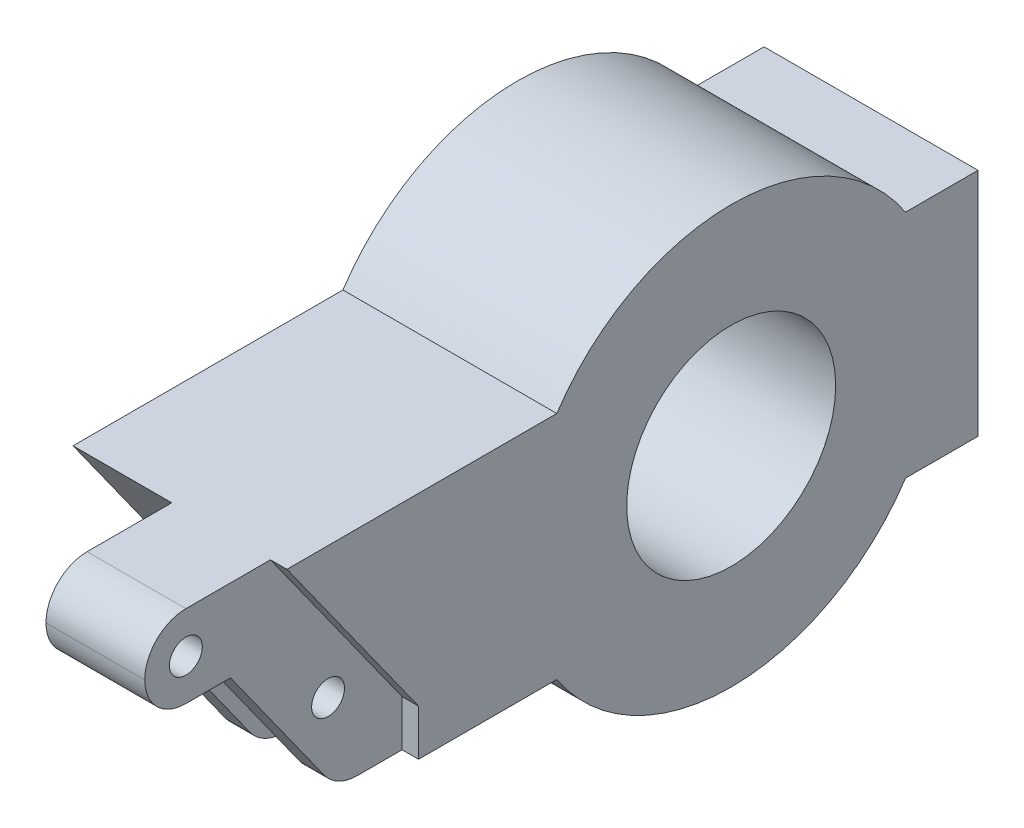
ISO-10303-21;
HEADER;
FILE_DESCRIPTION(('STEP AP214'),'2;1');
FILE_NAME('part.step','',(''),(''),'','','');
FILE_SCHEMA(('AUTOMOTIVE_DESIGN { 1 0 10303 214 1 1 1 1 }'));
ENDSEC;
DATA;
#1=APPLICATION_CONTEXT('core data for automotive mechanical design processes');
#2=APPLICATION_PROTOCOL_DEFINITION('international standard','automotive_design',2000,#1);
#3=PRODUCT_CONTEXT('',#1,'mechanical');
#4=PRODUCT('Part','Part','',(#3));
#5=PRODUCT_RELATED_PRODUCT_CATEGORY('part','',(#4));
#6=PRODUCT_DEFINITION_FORMATION('','',#4);
#7=PRODUCT_DEFINITION_CONTEXT('part definition',#1,'design');
#8=PRODUCT_DEFINITION('design','',#6,#7);
#9=PRODUCT_DEFINITION_SHAPE('','',#8);
#10=(LENGTH_UNIT() NAMED_UNIT(*) SI_UNIT(.MILLI.,.METRE.));
#11=(NAMED_UNIT(*) PLANE_ANGLE_UNIT() SI_UNIT($,.RADIAN.));
#12=(NAMED_UNIT(*) SI_UNIT($,.STERADIAN.) SOLID_ANGLE_UNIT());
#13=UNCERTAINTY_MEASURE_WITH_UNIT(LENGTH_MEASURE(1.E-05),#10,'distance_accuracy_value','');
#14=(GEOMETRIC_REPRESENTATION_CONTEXT(3) GLOBAL_UNCERTAINTY_ASSIGNED_CONTEXT((#13)) GLOBAL_UNIT_ASSIGNED_CONTEXT((#10,
#11,#12)) REPRESENTATION_CONTEXT('',''));
#15=CARTESIAN_POINT('',(0.,0.,0.));
#16=DIRECTION('',(0.,0.,1.));
#17=DIRECTION('',(1.,0.,0.));
#18=AXIS2_PLACEMENT_3D('',#15,#16,#17);
#19=CARTESIAN_POINT('',(9.,6.99999999999999,0.));
#20=DIRECTION('',(0.,1.,0.));
#21=DIRECTION('',(0.,0.,1.));
#22=AXIS2_PLACEMENT_3D('',#19,#20,#21);
#23=PLANE('',#22);
#24=DIRECTION('',(-1.,0.,0.));
#25=VECTOR('',#24,1.);
#26=CARTESIAN_POINT('',(9.,6.99999999999999,4.40330240121952));
#27=LINE('',#26,#25);
#28=CARTESIAN_POINT('',(4.,6.99999999999999,4.40330240121952));
#29=VERTEX_POINT('',#28);
#30=CARTESIAN_POINT('',(-9.,6.99999999999999,4.40330240121952));
#31=VERTEX_POINT('',#30);
#32=EDGE_CURVE('E221',#29,#31,#27,.T.);
#33=ORIENTED_EDGE('',*,*,#32,.F.);
#34=DIRECTION('',(0.,0.,-1.));
#35=VECTOR('',#34,1.);
#36=CARTESIAN_POINT('',(4.,6.99999999999999,0.));
#37=LINE('',#36,#35);
#38=CARTESIAN_POINT('',(4.,6.99999999999999,0.));
#39=VERTEX_POINT('',#38);
#40=EDGE_CURVE('E207',#29,#39,#37,.T.);
#41=ORIENTED_EDGE('',*,*,#40,.T.);
#42=DIRECTION('',(-1.,0.,0.));
#43=VECTOR('',#42,1.);
#44=CARTESIAN_POINT('',(9.,6.99999999999999,0.));
#45=LINE('',#44,#43);
#46=CARTESIAN_POINT('',(-9.,6.99999999999999,0.));
#47=VERTEX_POINT('',#46);
#48=EDGE_CURVE('E219',#39,#47,#45,.T.);
#49=ORIENTED_EDGE('',*,*,#48,.T.);
#50=DIRECTION('',(0.,0.,-1.));
#51=VECTOR('',#50,1.);
#52=CARTESIAN_POINT('',(-9.,6.99999999999999,0.));
#53=LINE('',#52,#51);
#54=EDGE_CURVE('E355',#31,#47,#53,.T.);
#55=ORIENTED_EDGE('',*,*,#54,.F.);
#56=EDGE_LOOP('',(#33,#41,#49,#55));
#57=FACE_BOUND('',#56,.T.);
#58=ADVANCED_FACE('F49',(#57),#23,.T.);
#59=CARTESIAN_POINT('',(9.,0.,15.));
#60=DIRECTION('',(-1.,0.,0.));
#61=DIRECTION('',(0.,0.,1.));
#62=AXIS2_PLACEMENT_3D('',#59,#60,#61);
#63=CYLINDRICAL_SURFACE('',#62,12.7);
#64=DIRECTION('',(-1.,0.,0.));
#65=VECTOR('',#64,1.);
#66=CARTESIAN_POINT('',(9.,6.99999999999999,25.5966975987805));
#67=LINE('',#66,#65);
#68=CARTESIAN_POINT('',(4.,6.99999999999999,25.5966975987805));
#69=VERTEX_POINT('',#68);
#70=CARTESIAN_POINT('',(-9.,6.99999999999999,25.5966975987805));
#71=VERTEX_POINT('',#70);
#72=EDGE_CURVE('E254',#69,#71,#67,.T.);
#73=ORIENTED_EDGE('',*,*,#72,.F.);
#74=CARTESIAN_POINT('',(4.,0.,15.));
#75=DIRECTION('',(1.,0.,0.));
#76=DIRECTION('',(0.,0.,-1.));
#77=AXIS2_PLACEMENT_3D('',#74,#75,#76);
#78=CIRCLE('',#77,12.7);
#79=EDGE_CURVE('E224',#29,#69,#78,.T.);
#80=ORIENTED_EDGE('',*,*,#79,.F.);
#81=ORIENTED_EDGE('',*,*,#32,.T.);
#82=CARTESIAN_POINT('',(-9.,0.,15.));
#83=DIRECTION('',(1.,0.,0.));
#84=DIRECTION('',(0.,0.,-1.));
#85=AXIS2_PLACEMENT_3D('',#82,#83,#84);
#86=CIRCLE('',#85,12.7);
#87=EDGE_CURVE('E358',#31,#71,#86,.T.);
#88=ORIENTED_EDGE('',*,*,#87,.T.);
#89=EDGE_LOOP('',(#73,#80,#81,#88));
#90=FACE_BOUND('',#89,.T.);
#91=ADVANCED_FACE('F550',(#90),#63,.T.);
#92=CARTESIAN_POINT('',(9.,6.99999999999999,0.));
#93=DIRECTION('',(0.,1.,0.));
#94=DIRECTION('',(0.,0.,1.));
#95=AXIS2_PLACEMENT_3D('',#92,#93,#94);
#96=PLANE('',#95);
#97=DIRECTION('',(1.,0.,0.));
#98=VECTOR('',#97,1.);
#99=CARTESIAN_POINT('',(-16.7989898732233,6.99999999999999,42.));
#100=LINE('',#99,#98);
#101=CARTESIAN_POINT('',(3.,6.99999999999999,42.));
#102=VERTEX_POINT('',#101);
#103=CARTESIAN_POINT('',(4.,6.99999999999999,42.));
#104=VERTEX_POINT('',#103);
#105=EDGE_CURVE('E433',#102,#104,#100,.T.);
#106=ORIENTED_EDGE('',*,*,#105,.T.);
#107=DIRECTION('',(0.,0.,-1.));
#108=VECTOR('',#107,1.);
#109=CARTESIAN_POINT('',(4.,6.99999999999999,0.));
#110=LINE('',#109,#108);
#111=EDGE_CURVE('E507',#104,#69,#110,.T.);
#112=ORIENTED_EDGE('',*,*,#111,.T.);
#113=ORIENTED_EDGE('',*,*,#72,.T.);
#114=DIRECTION('',(0.,0.,-1.));
#115=VECTOR('',#114,1.);
#116=CARTESIAN_POINT('',(-9.,6.99999999999999,0.));
#117=LINE('',#116,#115);
#118=CARTESIAN_POINT('',(-9.,6.99999999999999,42.));
#119=VERTEX_POINT('',#118);
#120=EDGE_CURVE('E362',#119,#71,#117,.T.);
#121=ORIENTED_EDGE('',*,*,#120,.F.);
#122=DIRECTION('',(-1.,0.,0.));
#123=VECTOR('',#122,1.);
#124=CARTESIAN_POINT('',(16.7989898732233,6.99999999999999,42.));
#125=LINE('',#124,#123);
#126=CARTESIAN_POINT('',(-3.,6.99999999999999,42.));
#127=VERTEX_POINT('',#126);
#128=EDGE_CURVE('E410',#127,#119,#125,.T.);
#129=ORIENTED_EDGE('',*,*,#128,.F.);
#130=DIRECTION('',(0.,0.,1.));
#131=VECTOR('',#130,1.);
#132=CARTESIAN_POINT('',(-3.,6.99999999999999,49.6420266903419));
#133=LINE('',#132,#131);
#134=CARTESIAN_POINT('',(-3.,6.99999999999999,47.1420266903419));
#135=VERTEX_POINT('',#134);
#136=EDGE_CURVE('E333',#127,#135,#133,.T.);
#137=ORIENTED_EDGE('',*,*,#136,.T.);
#138=DIRECTION('',(1.,0.,0.));
#139=VECTOR('',#138,1.);
#140=CARTESIAN_POINT('',(9.,7.,47.1420266903419));
#141=LINE('',#140,#139);
#142=CARTESIAN_POINT('',(3.,6.99999999999999,47.1420266903419));
#143=VERTEX_POINT('',#142);
#144=EDGE_CURVE('E279',#135,#143,#141,.T.);
#145=ORIENTED_EDGE('',*,*,#144,.T.);
#146=DIRECTION('',(0.,0.,-1.));
#147=VECTOR('',#146,1.);
#148=CARTESIAN_POINT('',(3.,6.99999999999999,49.6420266903419));
#149=LINE('',#148,#147);
#150=EDGE_CURVE('E342',#143,#102,#149,.T.);
#151=ORIENTED_EDGE('',*,*,#150,.T.);
#152=EDGE_LOOP('',(#106,#112,#113,#121,#129,#137,#145,#151));
#153=FACE_BOUND('',#152,.T.);
#154=ADVANCED_FACE('F506',(#153),#96,.T.);
#155=CARTESIAN_POINT('',(9.,-6.99999999999999,0.));
#156=DIRECTION('',(0.,1.,0.));
#157=DIRECTION('',(0.,0.,1.));
#158=AXIS2_PLACEMENT_3D('',#155,#156,#157);
#159=PLANE('',#158);
#160=DIRECTION('',(0.,0.,-1.));
#161=VECTOR('',#160,1.);
#162=CARTESIAN_POINT('',(4.,-6.99999999999999,0.));
#163=LINE('',#162,#161);
#164=CARTESIAN_POINT('',(4.,-7.,34.));
#165=VERTEX_POINT('',#164);
#166=CARTESIAN_POINT('',(4.,-7.,25.5966975987805));
#167=VERTEX_POINT('',#166);
#168=EDGE_CURVE('E495',#165,#167,#163,.T.);
#169=ORIENTED_EDGE('',*,*,#168,.F.);
#170=DIRECTION('',(1.,0.,0.));
#171=VECTOR('',#170,1.);
#172=CARTESIAN_POINT('',(-16.7989898732233,-7.00000000000001,34.));
#173=LINE('',#172,#171);
#174=CARTESIAN_POINT('',(3.,-7.00000000000001,34.));
#175=VERTEX_POINT('',#174);
#176=EDGE_CURVE('E427',#175,#165,#173,.T.);
#177=ORIENTED_EDGE('',*,*,#176,.F.);
#178=DIRECTION('',(0.,0.,1.));
#179=VECTOR('',#178,1.);
#180=CARTESIAN_POINT('',(3.,-7.00000000000001,38.));
#181=LINE('',#180,#179);
#182=CARTESIAN_POINT('',(3.,-7.00000000000001,36.7134552617705));
#183=VERTEX_POINT('',#182);
#184=EDGE_CURVE('E428',#175,#183,#181,.T.);
#185=ORIENTED_EDGE('',*,*,#184,.T.);
#186=DIRECTION('',(-1.,0.,0.));
#187=VECTOR('',#186,1.);
#188=CARTESIAN_POINT('',(9.,-7.00000000000001,36.7134552617705));
#189=LINE('',#188,#187);
#190=CARTESIAN_POINT('',(1.5,-7.00000000000008,36.7134552617705));
#191=VERTEX_POINT('',#190);
#192=EDGE_CURVE('E247',#183,#191,#189,.T.);
#193=ORIENTED_EDGE('',*,*,#192,.T.);
#194=DIRECTION('',(0.,0.,1.));
#195=VECTOR('',#194,1.);
#196=CARTESIAN_POINT('',(1.5,-7.00000000000007,35.9977889397873));
#197=LINE('',#196,#195);
#198=CARTESIAN_POINT('',(1.5,-7.00000000000007,35.9977889397873));
#199=VERTEX_POINT('',#198);
#200=EDGE_CURVE('E317',#199,#191,#197,.T.);
#201=ORIENTED_EDGE('',*,*,#200,.F.);
#202=DIRECTION('',(1.,0.,0.));
#203=VECTOR('',#202,1.);
#204=CARTESIAN_POINT('',(1.5,-7.00000000000007,35.9977889397873));
#205=LINE('',#204,#203);
#206=CARTESIAN_POINT('',(-1.5,-7.00000000000001,35.9977889397873));
#207=VERTEX_POINT('',#206);
#208=EDGE_CURVE('E466',#207,#199,#205,.T.);
#209=ORIENTED_EDGE('',*,*,#208,.F.);
#210=DIRECTION('',(0.,0.,-1.));
#211=VECTOR('',#210,1.);
#212=CARTESIAN_POINT('',(-1.5,-7.00000000000007,35.9977889397873));
#213=LINE('',#212,#211);
#214=CARTESIAN_POINT('',(-1.5,-7.00000000000008,36.7134552617705));
#215=VERTEX_POINT('',#214);
#216=EDGE_CURVE('E458',#215,#207,#213,.T.);
#217=ORIENTED_EDGE('',*,*,#216,.F.);
#218=CARTESIAN_POINT('',(-3.,-7.00000000000001,36.7134552617705));
#219=VERTEX_POINT('',#218);
#220=EDGE_CURVE('E246',#215,#219,#189,.T.);
#221=ORIENTED_EDGE('',*,*,#220,.T.);
#222=DIRECTION('',(0.,0.,-1.));
#223=VECTOR('',#222,1.);
#224=CARTESIAN_POINT('',(-3.,-7.00000000000001,34.));
#225=LINE('',#224,#223);
#226=CARTESIAN_POINT('',(-3.,-7.00000000000001,34.));
#227=VERTEX_POINT('',#226);
#228=EDGE_CURVE('E413',#219,#227,#225,.T.);
#229=ORIENTED_EDGE('',*,*,#228,.T.);
#230=DIRECTION('',(-1.,0.,0.));
#231=VECTOR('',#230,1.);
#232=CARTESIAN_POINT('',(16.7989898732233,-7.00000000000001,34.));
#233=LINE('',#232,#231);
#234=CARTESIAN_POINT('',(-9.,-7.00000000000001,34.));
#235=VERTEX_POINT('',#234);
#236=EDGE_CURVE('E393',#227,#235,#233,.T.);
#237=ORIENTED_EDGE('',*,*,#236,.T.);
#238=DIRECTION('',(0.,0.,-1.));
#239=VECTOR('',#238,1.);
#240=CARTESIAN_POINT('',(-9.,-6.99999999999999,0.));
#241=LINE('',#240,#239);
#242=CARTESIAN_POINT('',(-9.,-7.,25.5966975987805));
#243=VERTEX_POINT('',#242);
#244=EDGE_CURVE('E366',#235,#243,#241,.T.);
#245=ORIENTED_EDGE('',*,*,#244,.T.);
#246=DIRECTION('',(-1.,0.,0.));
#247=VECTOR('',#246,1.);
#248=CARTESIAN_POINT('',(9.,-7.,25.5966975987805));
#249=LINE('',#248,#247);
#250=EDGE_CURVE('E243',#167,#243,#249,.T.);
#251=ORIENTED_EDGE('',*,*,#250,.F.);
#252=EDGE_LOOP('',(#169,#177,#185,#193,#201,#209,#217,#221,#229,#237,#245,#251));
#253=FACE_BOUND('',#252,.T.);
#254=ADVANCED_FACE('F391',(#253),#159,.F.);
#255=CARTESIAN_POINT('',(9.,0.,15.));
#256=DIRECTION('',(-1.,0.,0.));
#257=DIRECTION('',(0.,0.,1.));
#258=AXIS2_PLACEMENT_3D('',#255,#256,#257);
#259=CYLINDRICAL_SURFACE('',#258,12.7);
#260=CARTESIAN_POINT('',(4.,0.,15.));
#261=DIRECTION('',(1.,0.,0.));
#262=DIRECTION('',(0.,0.,-1.));
#263=AXIS2_PLACEMENT_3D('',#260,#261,#262);
#264=CIRCLE('',#263,12.7);
#265=CARTESIAN_POINT('',(4.,-6.99999999999999,4.40330240121952));
#266=VERTEX_POINT('',#265);
#267=EDGE_CURVE('E223',#167,#266,#264,.T.);
#268=ORIENTED_EDGE('',*,*,#267,.F.);
#269=ORIENTED_EDGE('',*,*,#250,.T.);
#270=CARTESIAN_POINT('',(-9.,0.,15.));
#271=DIRECTION('',(1.,0.,0.));
#272=DIRECTION('',(0.,0.,-1.));
#273=AXIS2_PLACEMENT_3D('',#270,#271,#272);
#274=CIRCLE('',#273,12.7);
#275=CARTESIAN_POINT('',(-9.,-6.99999999999999,4.40330240121952));
#276=VERTEX_POINT('',#275);
#277=EDGE_CURVE('E370',#243,#276,#274,.T.);
#278=ORIENTED_EDGE('',*,*,#277,.T.);
#279=DIRECTION('',(-1.,0.,0.));
#280=VECTOR('',#279,1.);
#281=CARTESIAN_POINT('',(9.,-6.99999999999999,4.40330240121952));
#282=LINE('',#281,#280);
#283=EDGE_CURVE('E235',#266,#276,#282,.T.);
#284=ORIENTED_EDGE('',*,*,#283,.F.);
#285=EDGE_LOOP('',(#268,#269,#278,#284));
#286=FACE_BOUND('',#285,.T.);
#287=ADVANCED_FACE('F385',(#286),#259,.T.);
#288=CARTESIAN_POINT('',(9.,-6.99999999999999,0.));
#289=DIRECTION('',(0.,1.,0.));
#290=DIRECTION('',(0.,0.,1.));
#291=AXIS2_PLACEMENT_3D('',#288,#289,#290);
#292=PLANE('',#291);
#293=DIRECTION('',(0.,0.,-1.));
#294=VECTOR('',#293,1.);
#295=CARTESIAN_POINT('',(4.,-6.99999999999999,0.));
#296=LINE('',#295,#294);
#297=CARTESIAN_POINT('',(4.,-6.99999999999999,0.));
#298=VERTEX_POINT('',#297);
#299=EDGE_CURVE('E210',#266,#298,#296,.T.);
#300=ORIENTED_EDGE('',*,*,#299,.F.);
#301=ORIENTED_EDGE('',*,*,#283,.T.);
#302=DIRECTION('',(0.,0.,-1.));
#303=VECTOR('',#302,1.);
#304=CARTESIAN_POINT('',(-9.,-6.99999999999999,0.));
#305=LINE('',#304,#303);
#306=CARTESIAN_POINT('',(-9.,-6.99999999999999,0.));
#307=VERTEX_POINT('',#306);
#308=EDGE_CURVE('E237',#276,#307,#305,.T.);
#309=ORIENTED_EDGE('',*,*,#308,.T.);
#310=DIRECTION('',(-1.,0.,0.));
#311=VECTOR('',#310,1.);
#312=CARTESIAN_POINT('',(9.,-6.99999999999999,0.));
#313=LINE('',#312,#311);
#314=EDGE_CURVE('E231',#298,#307,#313,.T.);
#315=ORIENTED_EDGE('',*,*,#314,.F.);
#316=EDGE_LOOP('',(#300,#301,#309,#315));
#317=FACE_BOUND('',#316,.T.);
#318=ADVANCED_FACE('F377',(#317),#292,.F.);
#319=CARTESIAN_POINT('',(9.,0.,15.));
#320=DIRECTION('',(-1.,0.,0.));
#321=DIRECTION('',(0.,0.,1.));
#322=AXIS2_PLACEMENT_3D('',#319,#320,#321);
#323=CYLINDRICAL_SURFACE('',#322,6.35);
#324=CARTESIAN_POINT('',(-9.,0.,15.));
#325=DIRECTION('',(1.,0.,0.));
#326=DIRECTION('',(0.,0.,-1.));
#327=AXIS2_PLACEMENT_3D('',#324,#325,#326);
#328=CIRCLE('',#327,6.35);
#329=CARTESIAN_POINT('',(-9.,0.,8.65));
#330=VERTEX_POINT('',#329);
#331=EDGE_CURVE('E346',#330,#330,#328,.T.);
#332=ORIENTED_EDGE('',*,*,#331,.F.);
#333=EDGE_LOOP('',(#332));
#334=FACE_BOUND('',#333,.T.);
#335=CARTESIAN_POINT('',(4.,0.,15.));
#336=DIRECTION('',(1.,0.,0.));
#337=DIRECTION('',(0.,0.,-1.));
#338=AXIS2_PLACEMENT_3D('',#335,#336,#337);
#339=CIRCLE('',#338,6.35);
#340=CARTESIAN_POINT('',(4.,0.,8.65));
#341=VERTEX_POINT('',#340);
#342=EDGE_CURVE('E406',#341,#341,#339,.T.);
#343=ORIENTED_EDGE('',*,*,#342,.T.);
#344=EDGE_LOOP('',(#343));
#345=FACE_BOUND('',#344,.T.);
#346=ADVANCED_FACE('F587',(#334,#345),#323,.F.);
#347=CARTESIAN_POINT('',(9.,0.,0.));
#348=DIRECTION('',(0.,0.,1.));
#349=DIRECTION('',(0.,-1.,0.));
#350=AXIS2_PLACEMENT_3D('',#347,#348,#349);
#351=PLANE('',#350);
#352=DIRECTION('',(0.,-1.,0.));
#353=VECTOR('',#352,1.);
#354=CARTESIAN_POINT('',(4.,12.7,0.));
#355=LINE('',#354,#353);
#356=EDGE_CURVE('E204',#39,#298,#355,.T.);
#357=ORIENTED_EDGE('',*,*,#356,.T.);
#358=ORIENTED_EDGE('',*,*,#314,.T.);
#359=DIRECTION('',(0.,1.,0.));
#360=VECTOR('',#359,1.);
#361=CARTESIAN_POINT('',(-9.,0.,0.));
#362=LINE('',#361,#360);
#363=EDGE_CURVE('E228',#307,#47,#362,.T.);
#364=ORIENTED_EDGE('',*,*,#363,.T.);
#365=ORIENTED_EDGE('',*,*,#48,.F.);
#366=EDGE_LOOP('',(#357,#358,#364,#365));
#367=FACE_BOUND('',#366,.T.);
#368=ADVANCED_FACE('F226',(#367),#351,.F.);
#369=CARTESIAN_POINT('',(-16.7989898732233,6.99999999999999,42.));
#370=DIRECTION('',(0.,0.581238193719096,-0.813733471206735));
#371=DIRECTION('',(0.,0.813733471206735,0.581238193719096));
#372=AXIS2_PLACEMENT_3D('',#369,#370,#371);
#373=PLANE('',#372);
#374=DIRECTION('',(0.,-0.813733471206735,-0.581238193719096));
#375=VECTOR('',#374,1.);
#376=CARTESIAN_POINT('',(4.,6.99999999999999,42.));
#377=LINE('',#376,#375);
#378=CARTESIAN_POINT('',(4.,-4.20000000000001,34.));
#379=VERTEX_POINT('',#378);
#380=EDGE_CURVE('E64',#104,#379,#377,.T.);
#381=ORIENTED_EDGE('',*,*,#380,.F.);
#382=ORIENTED_EDGE('',*,*,#105,.F.);
#383=DIRECTION('',(0.,-0.813733471206735,-0.581238193719096));
#384=VECTOR('',#383,1.);
#385=CARTESIAN_POINT('',(3.,6.99999999999999,42.));
#386=LINE('',#385,#384);
#387=CARTESIAN_POINT('',(3.,-4.20000000000001,34.));
#388=VERTEX_POINT('',#387);
#389=EDGE_CURVE('E436',#102,#388,#386,.T.);
#390=ORIENTED_EDGE('',*,*,#389,.T.);
#391=DIRECTION('',(1.,0.,0.));
#392=VECTOR('',#391,1.);
#393=CARTESIAN_POINT('',(-16.7989898732233,-4.20000000000001,34.));
#394=LINE('',#393,#392);
#395=EDGE_CURVE('E443',#388,#379,#394,.T.);
#396=ORIENTED_EDGE('',*,*,#395,.T.);
#397=EDGE_LOOP('',(#381,#382,#390,#396));
#398=FACE_BOUND('',#397,.T.);
#399=ADVANCED_FACE('F503',(#398),#373,.F.);
#400=CARTESIAN_POINT('',(-16.7989898732233,-4.20000000000001,34.));
#401=DIRECTION('',(0.,0.,-1.));
#402=DIRECTION('',(-1.,0.,0.));
#403=AXIS2_PLACEMENT_3D('',#400,#401,#402);
#404=PLANE('',#403);
#405=DIRECTION('',(0.,-1.,0.));
#406=VECTOR('',#405,1.);
#407=CARTESIAN_POINT('',(4.,-4.20000000000001,34.));
#408=LINE('',#407,#406);
#409=EDGE_CURVE('E11',#379,#165,#408,.T.);
#410=ORIENTED_EDGE('',*,*,#409,.F.);
#411=ORIENTED_EDGE('',*,*,#395,.F.);
#412=DIRECTION('',(0.,-1.,0.));
#413=VECTOR('',#412,1.);
#414=CARTESIAN_POINT('',(3.,-4.20000000000001,34.));
#415=LINE('',#414,#413);
#416=EDGE_CURVE('E432',#388,#175,#415,.T.);
#417=ORIENTED_EDGE('',*,*,#416,.T.);
#418=ORIENTED_EDGE('',*,*,#176,.T.);
#419=EDGE_LOOP('',(#410,#411,#417,#418));
#420=FACE_BOUND('',#419,.T.);
#421=ADVANCED_FACE('F497',(#420),#404,.F.);
#422=CARTESIAN_POINT('',(9.,-20.3378378378378,28.472972972973));
#423=DIRECTION('',(0.,0.581238193719097,-0.813733471206735));
#424=DIRECTION('',(0.,0.813733471206735,0.581238193719097));
#425=AXIS2_PLACEMENT_3D('',#422,#423,#424);
#426=PLANE('',#425);
#427=DIRECTION('',(0.,-0.813733471206735,-0.581238193719097));
#428=VECTOR('',#427,1.);
#429=CARTESIAN_POINT('',(-3.,-7.00000000000001,38.));
#430=LINE('',#429,#428);
#431=CARTESIAN_POINT('',(-3.,1.99999999999999,44.4285714285714));
#432=VERTEX_POINT('',#431);
#433=CARTESIAN_POINT('',(-3.,-5.95309548429775,38.7477889397873));
#434=VERTEX_POINT('',#433);
#435=EDGE_CURVE('E526',#432,#434,#430,.T.);
#436=ORIENTED_EDGE('',*,*,#435,.T.);
#437=DIRECTION('',(-1.,0.,0.));
#438=VECTOR('',#437,1.);
#439=CARTESIAN_POINT('',(9.,-5.95309548429775,38.7477889397873));
#440=LINE('',#439,#438);
#441=CARTESIAN_POINT('',(-1.5,-5.95309548429775,38.7477889397873));
#442=VERTEX_POINT('',#441);
#443=EDGE_CURVE('E250',#442,#434,#440,.T.);
#444=ORIENTED_EDGE('',*,*,#443,.F.);
#445=DIRECTION('',(0.,0.813733471206735,0.581238193719097));
#446=VECTOR('',#445,1.);
#447=CARTESIAN_POINT('',(-1.5,-20.3378378378378,28.472972972973));
#448=LINE('',#447,#446);
#449=CARTESIAN_POINT('',(-1.5,0.499999999999908,43.3571428571428));
#450=VERTEX_POINT('',#449);
#451=EDGE_CURVE('E287',#442,#450,#448,.T.);
#452=ORIENTED_EDGE('',*,*,#451,.T.);
#453=DIRECTION('',(-1.,0.,0.));
#454=VECTOR('',#453,1.);
#455=CARTESIAN_POINT('',(9.,0.499999999999907,43.3571428571428));
#456=LINE('',#455,#454);
#457=CARTESIAN_POINT('',(1.5,0.499999999999908,43.3571428571428));
#458=VERTEX_POINT('',#457);
#459=EDGE_CURVE('E58',#458,#450,#456,.T.);
#460=ORIENTED_EDGE('',*,*,#459,.F.);
#461=DIRECTION('',(0.,-0.813733471206735,-0.581238193719097));
#462=VECTOR('',#461,1.);
#463=CARTESIAN_POINT('',(1.50000000000001,-20.3378378378378,28.472972972973));
#464=LINE('',#463,#462);
#465=CARTESIAN_POINT('',(1.5,-5.95309548429775,38.7477889397873));
#466=VERTEX_POINT('',#465);
#467=EDGE_CURVE('E298',#458,#466,#464,.T.);
#468=ORIENTED_EDGE('',*,*,#467,.T.);
#469=CARTESIAN_POINT('',(3.,-5.95309548429775,38.7477889397873));
#470=VERTEX_POINT('',#469);
#471=EDGE_CURVE('E251',#470,#466,#440,.T.);
#472=ORIENTED_EDGE('',*,*,#471,.F.);
#473=DIRECTION('',(0.,0.813733471206735,0.581238193719097));
#474=VECTOR('',#473,1.);
#475=CARTESIAN_POINT('',(3.,6.99999999999999,48.));
#476=LINE('',#475,#474);
#477=CARTESIAN_POINT('',(3.,1.99999999999999,44.4285714285714));
#478=VERTEX_POINT('',#477);
#479=EDGE_CURVE('E439',#470,#478,#476,.T.);
#480=ORIENTED_EDGE('',*,*,#479,.T.);
#481=DIRECTION('',(1.,0.,0.));
#482=VECTOR('',#481,1.);
#483=CARTESIAN_POINT('',(9.,1.99999999999999,44.4285714285714));
#484=LINE('',#483,#482);
#485=EDGE_CURVE('E259',#432,#478,#484,.T.);
#486=ORIENTED_EDGE('',*,*,#485,.F.);
#487=EDGE_LOOP('',(#436,#444,#452,#460,#468,#472,#480,#486));
#488=FACE_BOUND('',#487,.T.);
#489=ADVANCED_FACE('F321',(#488),#426,.F.);
#490=CARTESIAN_POINT('',(9.,-4.50000000000001,36.7134552617705));
#491=DIRECTION('',(-1.,0.,0.));
#492=DIRECTION('',(0.,0.,1.));
#493=AXIS2_PLACEMENT_3D('',#490,#491,#492);
#494=CYLINDRICAL_SURFACE('',#493,2.5);
#495=CARTESIAN_POINT('',(-3.,-4.50000000000001,36.7134552617705));
#496=DIRECTION('',(-1.,0.,0.));
#497=DIRECTION('',(0.,0.,1.));
#498=AXIS2_PLACEMENT_3D('',#495,#496,#497);
#499=CIRCLE('',#498,2.5);
#500=EDGE_CURVE('E424',#219,#434,#499,.T.);
#501=ORIENTED_EDGE('',*,*,#500,.F.);
#502=ORIENTED_EDGE('',*,*,#220,.F.);
#503=CARTESIAN_POINT('',(-1.5,-4.50000000000001,36.7134552617705));
#504=DIRECTION('',(-1.,0.,0.));
#505=DIRECTION('',(0.,0.,1.));
#506=AXIS2_PLACEMENT_3D('',#503,#504,#505);
#507=CIRCLE('',#506,2.5);
#508=EDGE_CURVE('E297',#215,#442,#507,.T.);
#509=ORIENTED_EDGE('',*,*,#508,.T.);
#510=ORIENTED_EDGE('',*,*,#443,.T.);
#511=EDGE_LOOP('',(#501,#502,#509,#510));
#512=FACE_BOUND('',#511,.T.);
#513=ADVANCED_FACE('F564',(#512),#494,.T.);
#514=CARTESIAN_POINT('',(9.,-2.00000000000001,38.4991695474848));
#515=DIRECTION('',(-1.,0.,0.));
#516=DIRECTION('',(0.,0.,1.));
#517=AXIS2_PLACEMENT_3D('',#514,#515,#516);
#518=CYLINDRICAL_SURFACE('',#517,0.999999999999998);
#519=CARTESIAN_POINT('',(-1.5,-2.00000000000001,38.4991695474848));
#520=DIRECTION('',(-1.,0.,0.));
#521=DIRECTION('',(0.,0.,1.));
#522=AXIS2_PLACEMENT_3D('',#519,#520,#521);
#523=CIRCLE('',#522,0.999999999999998);
#524=CARTESIAN_POINT('',(-1.5,-2.00000000000001,39.4991695474848));
#525=VERTEX_POINT('',#524);
#526=EDGE_CURVE('E294',#525,#525,#523,.T.);
#527=ORIENTED_EDGE('',*,*,#526,.F.);
#528=EDGE_LOOP('',(#527));
#529=FACE_BOUND('',#528,.T.);
#530=CARTESIAN_POINT('',(-3.,-2.00000000000001,38.4991695474848));
#531=DIRECTION('',(-1.,0.,0.));
#532=DIRECTION('',(0.,0.,1.));
#533=AXIS2_PLACEMENT_3D('',#530,#531,#532);
#534=CIRCLE('',#533,0.999999999999998);
#535=CARTESIAN_POINT('',(-3.,-2.00000000000001,39.4991695474848));
#536=VERTEX_POINT('',#535);
#537=EDGE_CURVE('E419',#536,#536,#534,.T.);
#538=ORIENTED_EDGE('',*,*,#537,.T.);
#539=EDGE_LOOP('',(#538));
#540=FACE_BOUND('',#539,.T.);
#541=ADVANCED_FACE('F594',(#529,#540),#518,.F.);
#542=CARTESIAN_POINT('',(3.,-4.50000000000001,36.7134552617705));
#543=DIRECTION('',(1.,0.,0.));
#544=DIRECTION('',(0.,0.,-1.));
#545=AXIS2_PLACEMENT_3D('',#542,#543,#544);
#546=CIRCLE('',#545,2.5);
#547=EDGE_CURVE('E456',#470,#183,#546,.T.);
#548=ORIENTED_EDGE('',*,*,#547,.F.);
#549=ORIENTED_EDGE('',*,*,#471,.T.);
#550=CARTESIAN_POINT('',(1.5,-4.50000000000001,36.7134552617705));
#551=DIRECTION('',(1.,0.,0.));
#552=DIRECTION('',(0.,0.,-1.));
#553=AXIS2_PLACEMENT_3D('',#550,#551,#552);
#554=CIRCLE('',#553,2.5);
#555=EDGE_CURVE('E292',#466,#191,#554,.T.);
#556=ORIENTED_EDGE('',*,*,#555,.T.);
#557=ORIENTED_EDGE('',*,*,#192,.F.);
#558=EDGE_LOOP('',(#548,#549,#556,#557));
#559=FACE_BOUND('',#558,.T.);
#560=ADVANCED_FACE('F487',(#559),#494,.T.);
#561=CARTESIAN_POINT('',(1.5,-2.00000000000001,38.4991695474848));
#562=DIRECTION('',(1.,0.,0.));
#563=DIRECTION('',(0.,0.,-1.));
#564=AXIS2_PLACEMENT_3D('',#561,#562,#563);
#565=CIRCLE('',#564,0.999999999999998);
#566=CARTESIAN_POINT('',(1.5,-2.00000000000001,37.4991695474848));
#567=VERTEX_POINT('',#566);
#568=EDGE_CURVE('E288',#567,#567,#565,.T.);
#569=ORIENTED_EDGE('',*,*,#568,.F.);
#570=EDGE_LOOP('',(#569));
#571=FACE_BOUND('',#570,.T.);
#572=CARTESIAN_POINT('',(3.,-2.00000000000001,38.4991695474848));
#573=DIRECTION('',(1.,0.,0.));
#574=DIRECTION('',(0.,0.,-1.));
#575=AXIS2_PLACEMENT_3D('',#572,#573,#574);
#576=CIRCLE('',#575,0.999999999999998);
#577=CARTESIAN_POINT('',(3.,-2.00000000000001,37.4991695474848));
#578=VERTEX_POINT('',#577);
#579=EDGE_CURVE('E452',#578,#578,#576,.T.);
#580=ORIENTED_EDGE('',*,*,#579,.T.);
#581=EDGE_LOOP('',(#580));
#582=FACE_BOUND('',#581,.T.);
#583=ADVANCED_FACE('F591',(#571,#582),#518,.F.);
#584=CARTESIAN_POINT('',(-9.,0.,0.));
#585=DIRECTION('',(1.,0.,0.));
#586=DIRECTION('',(0.,0.,-1.));
#587=AXIS2_PLACEMENT_3D('',#584,#585,#586);
#588=PLANE('',#587);
#589=ORIENTED_EDGE('',*,*,#331,.T.);
#590=EDGE_LOOP('',(#589));
#591=FACE_BOUND('',#590,.T.);
#592=DIRECTION('',(0.,-1.,0.));
#593=VECTOR('',#592,1.);
#594=CARTESIAN_POINT('',(-9.,-4.20000000000003,34.));
#595=LINE('',#594,#593);
#596=CARTESIAN_POINT('',(-9.,-4.20000000000003,34.));
#597=VERTEX_POINT('',#596);
#598=EDGE_CURVE('E395',#597,#235,#595,.T.);
#599=ORIENTED_EDGE('',*,*,#598,.F.);
#600=DIRECTION('',(0.,-0.813733471206735,-0.581238193719096));
#601=VECTOR('',#600,1.);
#602=CARTESIAN_POINT('',(-9.,6.99999999999999,42.));
#603=LINE('',#602,#601);
#604=EDGE_CURVE('E397',#119,#597,#603,.T.);
#605=ORIENTED_EDGE('',*,*,#604,.F.);
#606=ORIENTED_EDGE('',*,*,#120,.T.);
#607=ORIENTED_EDGE('',*,*,#87,.F.);
#608=ORIENTED_EDGE('',*,*,#54,.T.);
#609=ORIENTED_EDGE('',*,*,#363,.F.);
#610=ORIENTED_EDGE('',*,*,#308,.F.);
#611=ORIENTED_EDGE('',*,*,#277,.F.);
#612=ORIENTED_EDGE('',*,*,#244,.F.);
#613=EDGE_LOOP('',(#599,#605,#606,#607,#608,#609,#610,#611,#612));
#614=FACE_BOUND('',#613,.T.);
#615=ADVANCED_FACE('F382',(#591,#614),#588,.F.);
#616=CARTESIAN_POINT('',(0.,1.99999999999999,0.));
#617=DIRECTION('',(0.,1.,0.));
#618=DIRECTION('',(0.,0.,1.));
#619=AXIS2_PLACEMENT_3D('',#616,#617,#618);
#620=PLANE('',#619);
#621=DIRECTION('',(0.,0.,-1.));
#622=VECTOR('',#621,1.);
#623=CARTESIAN_POINT('',(3.,1.99999999999999,49.6420266903419));
#624=LINE('',#623,#622);
#625=CARTESIAN_POINT('',(3.,1.99999999999999,47.1420266903419));
#626=VERTEX_POINT('',#625);
#627=EDGE_CURVE('E341',#626,#478,#624,.T.);
#628=ORIENTED_EDGE('',*,*,#627,.F.);
#629=DIRECTION('',(1.,0.,0.));
#630=VECTOR('',#629,1.);
#631=CARTESIAN_POINT('',(-3.,1.99999999999999,47.1420266903419));
#632=LINE('',#631,#630);
#633=CARTESIAN_POINT('',(-3.,1.99999999999999,47.1420266903419));
#634=VERTEX_POINT('',#633);
#635=EDGE_CURVE('E269',#626,#634,#632,.F.);
#636=ORIENTED_EDGE('',*,*,#635,.T.);
#637=DIRECTION('',(0.,0.,1.));
#638=VECTOR('',#637,1.);
#639=CARTESIAN_POINT('',(-3.,1.99999999999999,49.6420266903419));
#640=LINE('',#639,#638);
#641=EDGE_CURVE('E337',#432,#634,#640,.T.);
#642=ORIENTED_EDGE('',*,*,#641,.F.);
#643=ORIENTED_EDGE('',*,*,#485,.T.);
#644=EDGE_LOOP('',(#628,#636,#642,#643));
#645=FACE_BOUND('',#644,.T.);
#646=ADVANCED_FACE('F519',(#645),#620,.F.);
#647=CARTESIAN_POINT('',(-3.,1.99999999999999,49.6420266903419));
#648=DIRECTION('',(-1.,0.,0.));
#649=DIRECTION('',(0.,0.,1.));
#650=AXIS2_PLACEMENT_3D('',#647,#648,#649);
#651=PLANE('',#650);
#652=CARTESIAN_POINT('',(-3.,4.49999999999999,47.1420266903419));
#653=DIRECTION('',(-1.,0.,0.));
#654=DIRECTION('',(0.,0.,1.));
#655=AXIS2_PLACEMENT_3D('',#652,#653,#654);
#656=CIRCLE('',#655,0.999999999999998);
#657=CARTESIAN_POINT('',(-3.,4.49999999999999,48.1420266903419));
#658=VERTEX_POINT('',#657);
#659=EDGE_CURVE('E286',#658,#658,#656,.F.);
#660=ORIENTED_EDGE('',*,*,#659,.T.);
#661=EDGE_LOOP('',(#660));
#662=FACE_BOUND('',#661,.T.);
#663=ORIENTED_EDGE('',*,*,#136,.F.);
#664=DIRECTION('',(0.,0.813733471206735,0.581238193719096));
#665=VECTOR('',#664,1.);
#666=CARTESIAN_POINT('',(-3.,6.99999999999999,42.));
#667=LINE('',#666,#665);
#668=CARTESIAN_POINT('',(-3.,-4.20000000000003,34.));
#669=VERTEX_POINT('',#668);
#670=EDGE_CURVE('E420',#669,#127,#667,.T.);
#671=ORIENTED_EDGE('',*,*,#670,.F.);
#672=DIRECTION('',(0.,1.,0.));
#673=VECTOR('',#672,1.);
#674=CARTESIAN_POINT('',(-3.,-4.20000000000003,34.));
#675=LINE('',#674,#673);
#676=EDGE_CURVE('E416',#227,#669,#675,.T.);
#677=ORIENTED_EDGE('',*,*,#676,.F.);
#678=ORIENTED_EDGE('',*,*,#228,.F.);
#679=ORIENTED_EDGE('',*,*,#500,.T.);
#680=ORIENTED_EDGE('',*,*,#435,.F.);
#681=ORIENTED_EDGE('',*,*,#641,.T.);
#682=CARTESIAN_POINT('',(-3.,4.49999999999999,47.1420266903419));
#683=DIRECTION('',(-1.,0.,0.));
#684=DIRECTION('',(0.,0.,1.));
#685=AXIS2_PLACEMENT_3D('',#682,#683,#684);
#686=CIRCLE('',#685,2.5);
#687=CARTESIAN_POINT('',(-3.,4.5,49.6420266903419));
#688=VERTEX_POINT('',#687);
#689=EDGE_CURVE('E276',#634,#688,#686,.T.);
#690=ORIENTED_EDGE('',*,*,#689,.T.);
#691=CARTESIAN_POINT('',(-3.,4.5,47.1420266903419));
#692=DIRECTION('',(-1.,0.,0.));
#693=DIRECTION('',(0.,0.,1.));
#694=AXIS2_PLACEMENT_3D('',#691,#692,#693);
#695=CIRCLE('',#694,2.5);
#696=EDGE_CURVE('E273',#688,#135,#695,.T.);
#697=ORIENTED_EDGE('',*,*,#696,.T.);
#698=EDGE_LOOP('',(#663,#671,#677,#678,#679,#680,#681,#690,#697));
#699=FACE_BOUND('',#698,.T.);
#700=ORIENTED_EDGE('',*,*,#537,.F.);
#701=EDGE_LOOP('',(#700));
#702=FACE_BOUND('',#701,.T.);
#703=ADVANCED_FACE('F524',(#662,#699,#702),#651,.T.);
#704=CARTESIAN_POINT('',(3.,1.99999999999999,49.6420266903419));
#705=DIRECTION('',(1.,0.,0.));
#706=DIRECTION('',(0.,0.,-1.));
#707=AXIS2_PLACEMENT_3D('',#704,#705,#706);
#708=PLANE('',#707);
#709=ORIENTED_EDGE('',*,*,#389,.F.);
#710=ORIENTED_EDGE('',*,*,#150,.F.);
#711=CARTESIAN_POINT('',(3.,4.5,47.1420266903419));
#712=DIRECTION('',(1.,0.,0.));
#713=DIRECTION('',(0.,0.,-1.));
#714=AXIS2_PLACEMENT_3D('',#711,#712,#713);
#715=CIRCLE('',#714,2.5);
#716=CARTESIAN_POINT('',(3.,4.5,49.6420266903419));
#717=VERTEX_POINT('',#716);
#718=EDGE_CURVE('E263',#143,#717,#715,.T.);
#719=ORIENTED_EDGE('',*,*,#718,.T.);
#720=CARTESIAN_POINT('',(3.,4.49999999999999,47.1420266903419));
#721=DIRECTION('',(1.,0.,0.));
#722=DIRECTION('',(0.,0.,-1.));
#723=AXIS2_PLACEMENT_3D('',#720,#721,#722);
#724=CIRCLE('',#723,2.5);
#725=EDGE_CURVE('E266',#717,#626,#724,.T.);
#726=ORIENTED_EDGE('',*,*,#725,.T.);
#727=ORIENTED_EDGE('',*,*,#627,.T.);
#728=ORIENTED_EDGE('',*,*,#479,.F.);
#729=ORIENTED_EDGE('',*,*,#547,.T.);
#730=ORIENTED_EDGE('',*,*,#184,.F.);
#731=ORIENTED_EDGE('',*,*,#416,.F.);
#732=EDGE_LOOP('',(#709,#710,#719,#726,#727,#728,#729,#730,#731));
#733=FACE_BOUND('',#732,.T.);
#734=CARTESIAN_POINT('',(3.,4.49999999999999,47.1420266903419));
#735=DIRECTION('',(1.,0.,0.));
#736=DIRECTION('',(0.,0.,-1.));
#737=AXIS2_PLACEMENT_3D('',#734,#735,#736);
#738=CIRCLE('',#737,0.999999999999998);
#739=CARTESIAN_POINT('',(3.,4.49999999999999,46.1420266903419));
#740=VERTEX_POINT('',#739);
#741=EDGE_CURVE('E329',#740,#740,#738,.T.);
#742=ORIENTED_EDGE('',*,*,#741,.F.);
#743=EDGE_LOOP('',(#742));
#744=FACE_BOUND('',#743,.T.);
#745=ORIENTED_EDGE('',*,*,#579,.F.);
#746=EDGE_LOOP('',(#745));
#747=FACE_BOUND('',#746,.T.);
#748=ADVANCED_FACE('F491',(#733,#744,#747),#708,.T.);
#749=CARTESIAN_POINT('',(-9.001,4.49999999999999,47.1420266903419));
#750=DIRECTION('',(1.,0.,0.));
#751=DIRECTION('',(0.,0.,-1.));
#752=AXIS2_PLACEMENT_3D('',#749,#750,#751);
#753=CYLINDRICAL_SURFACE('',#752,0.999999999999998);
#754=ORIENTED_EDGE('',*,*,#659,.F.);
#755=EDGE_LOOP('',(#754));
#756=FACE_BOUND('',#755,.T.);
#757=ORIENTED_EDGE('',*,*,#741,.T.);
#758=EDGE_LOOP('',(#757));
#759=FACE_BOUND('',#758,.T.);
#760=ADVANCED_FACE('F601',(#756,#759),#753,.F.);
#761=CARTESIAN_POINT('',(9.,4.5,47.1420266903419));
#762=DIRECTION('',(1.,0.,0.));
#763=DIRECTION('',(0.,0.,-1.));
#764=AXIS2_PLACEMENT_3D('',#761,#762,#763);
#765=CYLINDRICAL_SURFACE('',#764,2.5);
#766=ORIENTED_EDGE('',*,*,#144,.F.);
#767=ORIENTED_EDGE('',*,*,#696,.F.);
#768=DIRECTION('',(1.,0.,0.));
#769=VECTOR('',#768,1.);
#770=CARTESIAN_POINT('',(3.,4.5,49.6420266903419));
#771=LINE('',#770,#769);
#772=EDGE_CURVE('E282',#717,#688,#771,.F.);
#773=ORIENTED_EDGE('',*,*,#772,.F.);
#774=ORIENTED_EDGE('',*,*,#718,.F.);
#775=EDGE_LOOP('',(#766,#767,#773,#774));
#776=FACE_BOUND('',#775,.T.);
#777=ADVANCED_FACE('F51',(#776),#765,.T.);
#778=CARTESIAN_POINT('',(3.,4.49999999999999,47.1420266903419));
#779=DIRECTION('',(-1.,0.,0.));
#780=DIRECTION('',(0.,0.,1.));
#781=AXIS2_PLACEMENT_3D('',#778,#779,#780);
#782=CYLINDRICAL_SURFACE('',#781,2.5);
#783=ORIENTED_EDGE('',*,*,#689,.F.);
#784=ORIENTED_EDGE('',*,*,#635,.F.);
#785=ORIENTED_EDGE('',*,*,#725,.F.);
#786=ORIENTED_EDGE('',*,*,#772,.T.);
#787=EDGE_LOOP('',(#783,#784,#785,#786));
#788=FACE_BOUND('',#787,.T.);
#789=ADVANCED_FACE('F522',(#788),#782,.T.);
#790=CARTESIAN_POINT('',(0.,0.500000000000007,0.));
#791=DIRECTION('',(0.,-1.,0.));
#792=DIRECTION('',(0.,0.,-1.));
#793=AXIS2_PLACEMENT_3D('',#790,#791,#792);
#794=PLANE('',#793);
#795=ORIENTED_EDGE('',*,*,#459,.T.);
#796=DIRECTION('',(0.,0.,-1.));
#797=VECTOR('',#796,1.);
#798=CARTESIAN_POINT('',(-1.5,0.499999999999925,35.9977889397873));
#799=LINE('',#798,#797);
#800=CARTESIAN_POINT('',(-1.5,0.499999999999925,35.9977889397873));
#801=VERTEX_POINT('',#800);
#802=EDGE_CURVE('E306',#450,#801,#799,.T.);
#803=ORIENTED_EDGE('',*,*,#802,.T.);
#804=DIRECTION('',(1.,0.,0.));
#805=VECTOR('',#804,1.);
#806=CARTESIAN_POINT('',(1.5,0.499999999999925,35.9977889397873));
#807=LINE('',#806,#805);
#808=CARTESIAN_POINT('',(1.5,0.499999999999925,35.9977889397873));
#809=VERTEX_POINT('',#808);
#810=EDGE_CURVE('E316',#801,#809,#807,.T.);
#811=ORIENTED_EDGE('',*,*,#810,.T.);
#812=DIRECTION('',(0.,0.,1.));
#813=VECTOR('',#812,1.);
#814=CARTESIAN_POINT('',(1.5,0.499999999999925,35.9977889397873));
#815=LINE('',#814,#813);
#816=EDGE_CURVE('E308',#809,#458,#815,.T.);
#817=ORIENTED_EDGE('',*,*,#816,.T.);
#818=EDGE_LOOP('',(#795,#803,#811,#817));
#819=FACE_BOUND('',#818,.T.);
#820=ADVANCED_FACE('F304',(#819),#794,.T.);
#821=CARTESIAN_POINT('',(-1.5,0.499999999999925,35.9977889397873));
#822=DIRECTION('',(-1.,0.,0.));
#823=DIRECTION('',(0.,0.,1.));
#824=AXIS2_PLACEMENT_3D('',#821,#822,#823);
#825=PLANE('',#824);
#826=ORIENTED_EDGE('',*,*,#526,.T.);
#827=EDGE_LOOP('',(#826));
#828=FACE_BOUND('',#827,.T.);
#829=ORIENTED_EDGE('',*,*,#508,.F.);
#830=ORIENTED_EDGE('',*,*,#216,.T.);
#831=DIRECTION('',(0.,-1.,0.));
#832=VECTOR('',#831,1.);
#833=CARTESIAN_POINT('',(-1.5,0.499999999999925,35.9977889397873));
#834=LINE('',#833,#832);
#835=EDGE_CURVE('E72',#801,#207,#834,.T.);
#836=ORIENTED_EDGE('',*,*,#835,.F.);
#837=ORIENTED_EDGE('',*,*,#802,.F.);
#838=ORIENTED_EDGE('',*,*,#451,.F.);
#839=EDGE_LOOP('',(#829,#830,#836,#837,#838));
#840=FACE_BOUND('',#839,.T.);
#841=ADVANCED_FACE('F313',(#828,#840),#825,.F.);
#842=CARTESIAN_POINT('',(1.5,0.499999999999925,35.9977889397873));
#843=DIRECTION('',(1.,0.,0.));
#844=DIRECTION('',(0.,0.,-1.));
#845=AXIS2_PLACEMENT_3D('',#842,#843,#844);
#846=PLANE('',#845);
#847=ORIENTED_EDGE('',*,*,#568,.T.);
#848=EDGE_LOOP('',(#847));
#849=FACE_BOUND('',#848,.T.);
#850=ORIENTED_EDGE('',*,*,#816,.F.);
#851=DIRECTION('',(0.,-1.,0.));
#852=VECTOR('',#851,1.);
#853=CARTESIAN_POINT('',(1.5,0.499999999999925,35.9977889397873));
#854=LINE('',#853,#852);
#855=EDGE_CURVE('E293',#809,#199,#854,.T.);
#856=ORIENTED_EDGE('',*,*,#855,.T.);
#857=ORIENTED_EDGE('',*,*,#200,.T.);
#858=ORIENTED_EDGE('',*,*,#555,.F.);
#859=ORIENTED_EDGE('',*,*,#467,.F.);
#860=EDGE_LOOP('',(#850,#856,#857,#858,#859));
#861=FACE_BOUND('',#860,.T.);
#862=ADVANCED_FACE('F482',(#849,#861),#846,.F.);
#863=CARTESIAN_POINT('',(1.5,0.499999999999925,35.9977889397873));
#864=DIRECTION('',(0.,0.,-1.));
#865=DIRECTION('',(0.,1.,0.));
#866=AXIS2_PLACEMENT_3D('',#863,#864,#865);
#867=PLANE('',#866);
#868=ORIENTED_EDGE('',*,*,#208,.T.);
#869=ORIENTED_EDGE('',*,*,#855,.F.);
#870=ORIENTED_EDGE('',*,*,#810,.F.);
#871=ORIENTED_EDGE('',*,*,#835,.T.);
#872=EDGE_LOOP('',(#868,#869,#870,#871));
#873=FACE_BOUND('',#872,.T.);
#874=ADVANCED_FACE('F565',(#873),#867,.F.);
#875=CARTESIAN_POINT('',(16.7989898732233,6.99999999999999,42.));
#876=DIRECTION('',(0.,0.581238193719096,-0.813733471206735));
#877=DIRECTION('',(0.,0.813733471206735,0.581238193719096));
#878=AXIS2_PLACEMENT_3D('',#875,#876,#877);
#879=PLANE('',#878);
#880=ORIENTED_EDGE('',*,*,#670,.T.);
#881=ORIENTED_EDGE('',*,*,#128,.T.);
#882=ORIENTED_EDGE('',*,*,#604,.T.);
#883=DIRECTION('',(-1.,0.,0.));
#884=VECTOR('',#883,1.);
#885=CARTESIAN_POINT('',(16.7989898732233,-4.20000000000003,34.));
#886=LINE('',#885,#884);
#887=EDGE_CURVE('E401',#669,#597,#886,.T.);
#888=ORIENTED_EDGE('',*,*,#887,.F.);
#889=EDGE_LOOP('',(#880,#881,#882,#888));
#890=FACE_BOUND('',#889,.T.);
#891=ADVANCED_FACE('F553',(#890),#879,.F.);
#892=CARTESIAN_POINT('',(16.7989898732233,-4.20000000000003,34.));
#893=DIRECTION('',(0.,0.,-1.));
#894=DIRECTION('',(0.,1.,0.));
#895=AXIS2_PLACEMENT_3D('',#892,#893,#894);
#896=PLANE('',#895);
#897=ORIENTED_EDGE('',*,*,#676,.T.);
#898=ORIENTED_EDGE('',*,*,#887,.T.);
#899=ORIENTED_EDGE('',*,*,#598,.T.);
#900=ORIENTED_EDGE('',*,*,#236,.F.);
#901=EDGE_LOOP('',(#897,#898,#899,#900));
#902=FACE_BOUND('',#901,.T.);
#903=ADVANCED_FACE('F573',(#902),#896,.F.);
#904=CARTESIAN_POINT('',(4.,0.,0.));
#905=DIRECTION('',(1.,0.,0.));
#906=DIRECTION('',(0.,0.,-1.));
#907=AXIS2_PLACEMENT_3D('',#904,#905,#906);
#908=PLANE('',#907);
#909=ORIENTED_EDGE('',*,*,#342,.F.);
#910=EDGE_LOOP('',(#909));
#911=FACE_BOUND('',#910,.T.);
#912=ORIENTED_EDGE('',*,*,#299,.T.);
#913=ORIENTED_EDGE('',*,*,#356,.F.);
#914=ORIENTED_EDGE('',*,*,#40,.F.);
#915=ORIENTED_EDGE('',*,*,#79,.T.);
#916=ORIENTED_EDGE('',*,*,#111,.F.);
#917=ORIENTED_EDGE('',*,*,#380,.T.);
#918=ORIENTED_EDGE('',*,*,#409,.T.);
#919=ORIENTED_EDGE('',*,*,#168,.T.);
#920=ORIENTED_EDGE('',*,*,#267,.T.);
#921=EDGE_LOOP('',(#912,#913,#914,#915,#916,#917,#918,#919,#920));
#922=FACE_BOUND('',#921,.T.);
#923=ADVANCED_FACE('F206',(#911,#922),#908,.T.);
#924=CLOSED_SHELL('',(#58,#91,#154,#254,#287,#318,#346,#368,#399,#421,#489,#513,#541,#560,#583,
#615,#646,#703,#748,#760,#777,#789,#820,#841,#862,#874,#891,#903,#923));
#925=MANIFOLD_SOLID_BREP('B2',#924);
#926=ADVANCED_BREP_SHAPE_REPRESENTATION('',(#18,#925),#14);
#927=SHAPE_DEFINITION_REPRESENTATION(#9,#926);
ENDSEC;
END-ISO-10303-21;
